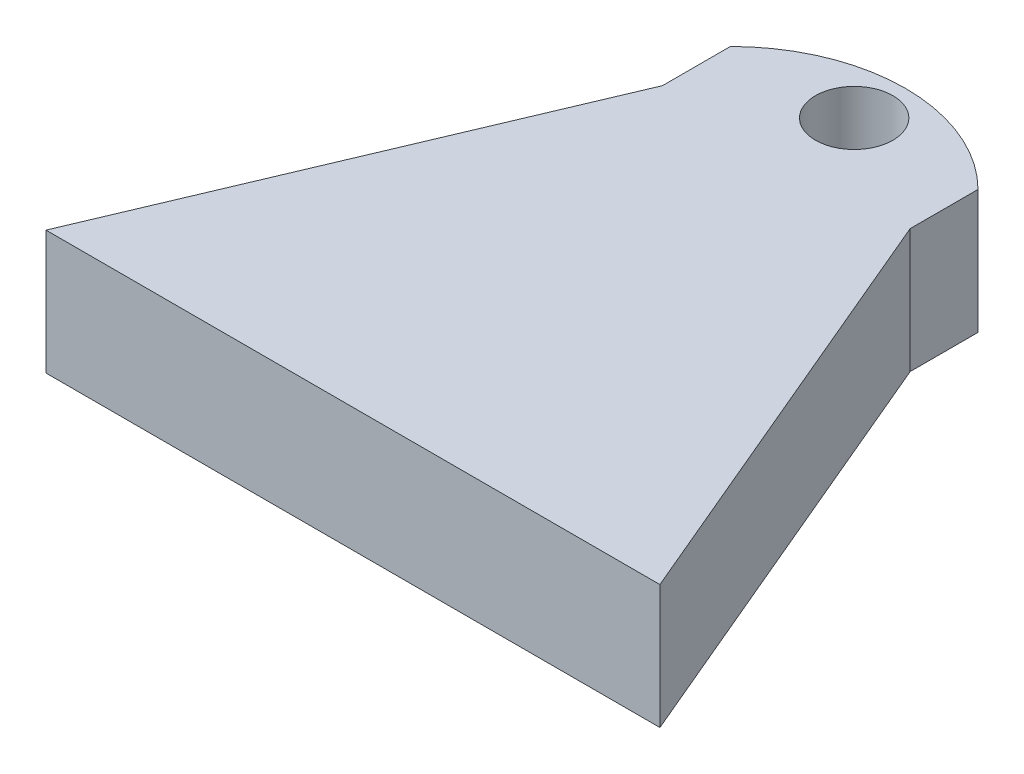
ISO-10303-21;
HEADER;
FILE_DESCRIPTION(('STEP AP214'),'2;1');
FILE_NAME('part.step','',(''),(''),'','','');
FILE_SCHEMA(('AUTOMOTIVE_DESIGN { 1 0 10303 214 1 1 1 1 }'));
ENDSEC;
DATA;
#1=APPLICATION_CONTEXT('core data for automotive mechanical design processes');
#2=APPLICATION_PROTOCOL_DEFINITION('international standard','automotive_design',2000,#1);
#3=PRODUCT_CONTEXT('',#1,'mechanical');
#4=PRODUCT('Part','Part','',(#3));
#5=PRODUCT_RELATED_PRODUCT_CATEGORY('part','',(#4));
#6=PRODUCT_DEFINITION_FORMATION('','',#4);
#7=PRODUCT_DEFINITION_CONTEXT('part definition',#1,'design');
#8=PRODUCT_DEFINITION('design','',#6,#7);
#9=PRODUCT_DEFINITION_SHAPE('','',#8);
#10=(LENGTH_UNIT() NAMED_UNIT(*) SI_UNIT(.MILLI.,.METRE.));
#11=(NAMED_UNIT(*) PLANE_ANGLE_UNIT() SI_UNIT($,.RADIAN.));
#12=(NAMED_UNIT(*) SI_UNIT($,.STERADIAN.) SOLID_ANGLE_UNIT());
#13=UNCERTAINTY_MEASURE_WITH_UNIT(LENGTH_MEASURE(1.E-05),#10,'distance_accuracy_value','');
#14=(GEOMETRIC_REPRESENTATION_CONTEXT(3) GLOBAL_UNCERTAINTY_ASSIGNED_CONTEXT((#13)) GLOBAL_UNIT_ASSIGNED_CONTEXT((#10,
#11,#12)) REPRESENTATION_CONTEXT('',''));
#15=CARTESIAN_POINT('',(0.,0.,0.));
#16=DIRECTION('',(0.,0.,1.));
#17=DIRECTION('',(1.,0.,0.));
#18=AXIS2_PLACEMENT_3D('',#15,#16,#17);
#19=CARTESIAN_POINT('',(62.966808864134,25.4,-77.4163427497838));
#20=DIRECTION('',(0.,-1.,0.));
#21=DIRECTION('',(0.,0.,-1.));
#22=AXIS2_PLACEMENT_3D('',#19,#20,#21);
#23=PLANE('',#22);
#24=DIRECTION('',(-0.389246854323353,0.,0.921133479143698));
#25=VECTOR('',#24,1.);
#26=CARTESIAN_POINT('',(0.,25.4,0.));
#27=LINE('',#26,#25);
#28=CARTESIAN_POINT('',(37.566808864134,25.4,-88.9));
#29=VERTEX_POINT('',#28);
#30=CARTESIAN_POINT('',(0.,25.4,0.));
#31=VERTEX_POINT('',#30);
#32=EDGE_CURVE('E146',#29,#31,#27,.T.);
#33=ORIENTED_EDGE('',*,*,#32,.T.);
#34=DIRECTION('',(1.,0.,0.));
#35=VECTOR('',#34,1.);
#36=CARTESIAN_POINT('',(0.,25.4,0.));
#37=LINE('',#36,#35);
#38=CARTESIAN_POINT('',(125.933617728268,25.4,0.));
#39=VERTEX_POINT('',#38);
#40=EDGE_CURVE('E94',#31,#39,#37,.T.);
#41=ORIENTED_EDGE('',*,*,#40,.T.);
#42=DIRECTION('',(-0.389246854323353,0.,-0.921133479143698));
#43=VECTOR('',#42,1.);
#44=CARTESIAN_POINT('',(125.933617728268,25.4,0.));
#45=LINE('',#44,#43);
#46=CARTESIAN_POINT('',(88.366808864134,25.4,-88.9));
#47=VERTEX_POINT('',#46);
#48=EDGE_CURVE('E107',#39,#47,#45,.T.);
#49=ORIENTED_EDGE('',*,*,#48,.T.);
#50=DIRECTION('',(0.,0.,-1.));
#51=VECTOR('',#50,1.);
#52=CARTESIAN_POINT('',(88.366808864134,25.4,-88.9));
#53=LINE('',#52,#51);
#54=CARTESIAN_POINT('',(88.366808864134,25.4,-102.816342749784));
#55=VERTEX_POINT('',#54);
#56=EDGE_CURVE('E101',#47,#55,#53,.T.);
#57=ORIENTED_EDGE('',*,*,#56,.T.);
#58=CARTESIAN_POINT('',(62.966808864134,25.4,-77.4163427497838));
#59=DIRECTION('',(0.,1.,0.));
#60=DIRECTION('',(0.,0.,-1.));
#61=AXIS2_PLACEMENT_3D('',#58,#59,#60);
#62=CIRCLE('',#61,35.9210244842767);
#63=CARTESIAN_POINT('',(37.566808864134,25.4,-102.816342749784));
#64=VERTEX_POINT('',#63);
#65=EDGE_CURVE('E105',#55,#64,#62,.T.);
#66=ORIENTED_EDGE('',*,*,#65,.T.);
#67=DIRECTION('',(0.,0.,1.));
#68=VECTOR('',#67,1.);
#69=CARTESIAN_POINT('',(37.566808864134,25.4,-88.9));
#70=LINE('',#69,#68);
#71=EDGE_CURVE('E57',#64,#29,#70,.T.);
#72=ORIENTED_EDGE('',*,*,#71,.T.);
#73=EDGE_LOOP('',(#33,#41,#49,#57,#66,#72));
#74=FACE_BOUND('',#73,.T.);
#75=CARTESIAN_POINT('',(62.966808864134,25.4,-102.816342749784));
#76=DIRECTION('',(0.,1.,0.));
#77=DIRECTION('',(0.,0.,1.));
#78=AXIS2_PLACEMENT_3D('',#75,#76,#77);
#79=CIRCLE('',#78,7.9375);
#80=CARTESIAN_POINT('',(62.966808864134,25.4,-94.8788427497839));
#81=VERTEX_POINT('',#80);
#82=EDGE_CURVE('E134',#81,#81,#79,.T.);
#83=ORIENTED_EDGE('',*,*,#82,.F.);
#84=EDGE_LOOP('',(#83));
#85=FACE_BOUND('',#84,.T.);
#86=ADVANCED_FACE('F39',(#74,#85),#23,.F.);
#87=CARTESIAN_POINT('',(62.966808864134,0.,-77.4163427497838));
#88=DIRECTION('',(0.,-1.,0.));
#89=DIRECTION('',(0.,0.,-1.));
#90=AXIS2_PLACEMENT_3D('',#87,#88,#89);
#91=PLANE('',#90);
#92=DIRECTION('',(-0.389246854323353,0.,0.921133479143698));
#93=VECTOR('',#92,1.);
#94=CARTESIAN_POINT('',(0.,0.,0.));
#95=LINE('',#94,#93);
#96=CARTESIAN_POINT('',(37.566808864134,0.,-88.9));
#97=VERTEX_POINT('',#96);
#98=CARTESIAN_POINT('',(0.,0.,0.));
#99=VERTEX_POINT('',#98);
#100=EDGE_CURVE('E129',#97,#99,#95,.T.);
#101=ORIENTED_EDGE('',*,*,#100,.F.);
#102=DIRECTION('',(0.,0.,1.));
#103=VECTOR('',#102,1.);
#104=CARTESIAN_POINT('',(37.566808864134,0.,-88.9));
#105=LINE('',#104,#103);
#106=CARTESIAN_POINT('',(37.566808864134,0.,-102.816342749784));
#107=VERTEX_POINT('',#106);
#108=EDGE_CURVE('E86',#107,#97,#105,.T.);
#109=ORIENTED_EDGE('',*,*,#108,.F.);
#110=CARTESIAN_POINT('',(62.966808864134,0.,-77.4163427497838));
#111=DIRECTION('',(0.,1.,0.));
#112=DIRECTION('',(0.,0.,-1.));
#113=AXIS2_PLACEMENT_3D('',#110,#111,#112);
#114=CIRCLE('',#113,35.9210244842767);
#115=CARTESIAN_POINT('',(88.366808864134,0.,-102.816342749784));
#116=VERTEX_POINT('',#115);
#117=EDGE_CURVE('E80',#116,#107,#114,.T.);
#118=ORIENTED_EDGE('',*,*,#117,.F.);
#119=DIRECTION('',(0.,0.,-1.));
#120=VECTOR('',#119,1.);
#121=CARTESIAN_POINT('',(88.366808864134,0.,-88.9));
#122=LINE('',#121,#120);
#123=CARTESIAN_POINT('',(88.366808864134,0.,-88.9));
#124=VERTEX_POINT('',#123);
#125=EDGE_CURVE('E116',#124,#116,#122,.T.);
#126=ORIENTED_EDGE('',*,*,#125,.F.);
#127=DIRECTION('',(-0.389246854323353,0.,-0.921133479143698));
#128=VECTOR('',#127,1.);
#129=CARTESIAN_POINT('',(125.933617728268,0.,0.));
#130=LINE('',#129,#128);
#131=CARTESIAN_POINT('',(125.933617728268,0.,0.));
#132=VERTEX_POINT('',#131);
#133=EDGE_CURVE('E137',#132,#124,#130,.T.);
#134=ORIENTED_EDGE('',*,*,#133,.F.);
#135=DIRECTION('',(1.,0.,0.));
#136=VECTOR('',#135,1.);
#137=CARTESIAN_POINT('',(0.,0.,0.));
#138=LINE('',#137,#136);
#139=EDGE_CURVE('E133',#99,#132,#138,.T.);
#140=ORIENTED_EDGE('',*,*,#139,.F.);
#141=EDGE_LOOP('',(#101,#109,#118,#126,#134,#140));
#142=FACE_BOUND('',#141,.T.);
#143=CARTESIAN_POINT('',(62.966808864134,0.,-102.816342749784));
#144=DIRECTION('',(0.,1.,0.));
#145=DIRECTION('',(0.,0.,1.));
#146=AXIS2_PLACEMENT_3D('',#143,#144,#145);
#147=CIRCLE('',#146,7.9375);
#148=CARTESIAN_POINT('',(62.966808864134,0.,-94.8788427497839));
#149=VERTEX_POINT('',#148);
#150=EDGE_CURVE('E243',#149,#149,#147,.T.);
#151=ORIENTED_EDGE('',*,*,#150,.T.);
#152=EDGE_LOOP('',(#151));
#153=FACE_BOUND('',#152,.T.);
#154=ADVANCED_FACE('F159',(#142,#153),#91,.T.);
#155=CARTESIAN_POINT('',(0.,25.4,0.));
#156=DIRECTION('',(0.921133479143698,0.,0.389246854323353));
#157=DIRECTION('',(0.389246854323353,0.,-0.921133479143698));
#158=AXIS2_PLACEMENT_3D('',#155,#156,#157);
#159=PLANE('',#158);
#160=ORIENTED_EDGE('',*,*,#100,.T.);
#161=DIRECTION('',(0.,-1.,0.));
#162=VECTOR('',#161,1.);
#163=CARTESIAN_POINT('',(0.,25.4,0.));
#164=LINE('',#163,#162);
#165=EDGE_CURVE('E11',#31,#99,#164,.T.);
#166=ORIENTED_EDGE('',*,*,#165,.F.);
#167=ORIENTED_EDGE('',*,*,#32,.F.);
#168=DIRECTION('',(0.,-1.,0.));
#169=VECTOR('',#168,1.);
#170=CARTESIAN_POINT('',(37.566808864134,25.4,-88.9));
#171=LINE('',#170,#169);
#172=EDGE_CURVE('E125',#29,#97,#171,.T.);
#173=ORIENTED_EDGE('',*,*,#172,.T.);
#174=EDGE_LOOP('',(#160,#166,#167,#173));
#175=FACE_BOUND('',#174,.T.);
#176=ADVANCED_FACE('F41',(#175),#159,.F.);
#177=CARTESIAN_POINT('',(0.,25.4,0.));
#178=DIRECTION('',(0.,0.,-1.));
#179=DIRECTION('',(-1.,0.,0.));
#180=AXIS2_PLACEMENT_3D('',#177,#178,#179);
#181=PLANE('',#180);
#182=ORIENTED_EDGE('',*,*,#139,.T.);
#183=DIRECTION('',(0.,-1.,0.));
#184=VECTOR('',#183,1.);
#185=CARTESIAN_POINT('',(125.933617728268,25.4,0.));
#186=LINE('',#185,#184);
#187=EDGE_CURVE('E49',#39,#132,#186,.T.);
#188=ORIENTED_EDGE('',*,*,#187,.F.);
#189=ORIENTED_EDGE('',*,*,#40,.F.);
#190=ORIENTED_EDGE('',*,*,#165,.T.);
#191=EDGE_LOOP('',(#182,#188,#189,#190));
#192=FACE_BOUND('',#191,.T.);
#193=ADVANCED_FACE('F184',(#192),#181,.F.);
#194=CARTESIAN_POINT('',(125.933617728268,25.4,0.));
#195=DIRECTION('',(-0.921133479143698,0.,0.389246854323353));
#196=DIRECTION('',(0.389246854323353,0.,0.921133479143698));
#197=AXIS2_PLACEMENT_3D('',#194,#195,#196);
#198=PLANE('',#197);
#199=ORIENTED_EDGE('',*,*,#133,.T.);
#200=DIRECTION('',(0.,-1.,0.));
#201=VECTOR('',#200,1.);
#202=CARTESIAN_POINT('',(88.366808864134,25.4,-88.9));
#203=LINE('',#202,#201);
#204=EDGE_CURVE('E118',#47,#124,#203,.T.);
#205=ORIENTED_EDGE('',*,*,#204,.F.);
#206=ORIENTED_EDGE('',*,*,#48,.F.);
#207=ORIENTED_EDGE('',*,*,#187,.T.);
#208=EDGE_LOOP('',(#199,#205,#206,#207));
#209=FACE_BOUND('',#208,.T.);
#210=ADVANCED_FACE('F156',(#209),#198,.F.);
#211=CARTESIAN_POINT('',(88.366808864134,25.4,-88.9));
#212=DIRECTION('',(-1.,0.,0.));
#213=DIRECTION('',(0.,0.,1.));
#214=AXIS2_PLACEMENT_3D('',#211,#212,#213);
#215=PLANE('',#214);
#216=ORIENTED_EDGE('',*,*,#125,.T.);
#217=DIRECTION('',(0.,-1.,0.));
#218=VECTOR('',#217,1.);
#219=CARTESIAN_POINT('',(88.366808864134,25.4,-102.816342749784));
#220=LINE('',#219,#218);
#221=EDGE_CURVE('E113',#55,#116,#220,.T.);
#222=ORIENTED_EDGE('',*,*,#221,.F.);
#223=ORIENTED_EDGE('',*,*,#56,.F.);
#224=ORIENTED_EDGE('',*,*,#204,.T.);
#225=EDGE_LOOP('',(#216,#222,#223,#224));
#226=FACE_BOUND('',#225,.T.);
#227=ADVANCED_FACE('F114',(#226),#215,.F.);
#228=CARTESIAN_POINT('',(62.966808864134,25.4,-77.4163427497838));
#229=DIRECTION('',(0.,-1.,0.));
#230=DIRECTION('',(0.,0.,-1.));
#231=AXIS2_PLACEMENT_3D('',#228,#229,#230);
#232=CYLINDRICAL_SURFACE('',#231,35.9210244842767);
#233=ORIENTED_EDGE('',*,*,#117,.T.);
#234=DIRECTION('',(0.,-1.,0.));
#235=VECTOR('',#234,1.);
#236=CARTESIAN_POINT('',(37.566808864134,25.4,-102.816342749784));
#237=LINE('',#236,#235);
#238=EDGE_CURVE('E119',#64,#107,#237,.T.);
#239=ORIENTED_EDGE('',*,*,#238,.F.);
#240=ORIENTED_EDGE('',*,*,#65,.F.);
#241=ORIENTED_EDGE('',*,*,#221,.T.);
#242=EDGE_LOOP('',(#233,#239,#240,#241));
#243=FACE_BOUND('',#242,.T.);
#244=ADVANCED_FACE('F121',(#243),#232,.T.);
#245=CARTESIAN_POINT('',(37.566808864134,25.4,-88.9));
#246=DIRECTION('',(1.,0.,0.));
#247=DIRECTION('',(0.,0.,-1.));
#248=AXIS2_PLACEMENT_3D('',#245,#246,#247);
#249=PLANE('',#248);
#250=ORIENTED_EDGE('',*,*,#108,.T.);
#251=ORIENTED_EDGE('',*,*,#172,.F.);
#252=ORIENTED_EDGE('',*,*,#71,.F.);
#253=ORIENTED_EDGE('',*,*,#238,.T.);
#254=EDGE_LOOP('',(#250,#251,#252,#253));
#255=FACE_BOUND('',#254,.T.);
#256=ADVANCED_FACE('F164',(#255),#249,.F.);
#257=CARTESIAN_POINT('',(62.966808864134,25.4,-102.816342749784));
#258=DIRECTION('',(0.,-1.,0.));
#259=DIRECTION('',(0.,0.,-1.));
#260=AXIS2_PLACEMENT_3D('',#257,#258,#259);
#261=CYLINDRICAL_SURFACE('',#260,7.9375);
#262=ORIENTED_EDGE('',*,*,#82,.T.);
#263=EDGE_LOOP('',(#262));
#264=FACE_BOUND('',#263,.T.);
#265=ORIENTED_EDGE('',*,*,#150,.F.);
#266=EDGE_LOOP('',(#265));
#267=FACE_BOUND('',#266,.T.);
#268=ADVANCED_FACE('F166',(#264,#267),#261,.F.);
#269=CLOSED_SHELL('',(#86,#154,#176,#193,#210,#227,#244,#256,#268));
#270=MANIFOLD_SOLID_BREP('B2',#269);
#271=ADVANCED_BREP_SHAPE_REPRESENTATION('',(#18,#270),#14);
#272=SHAPE_DEFINITION_REPRESENTATION(#9,#271);
ENDSEC;
END-ISO-10303-21;
